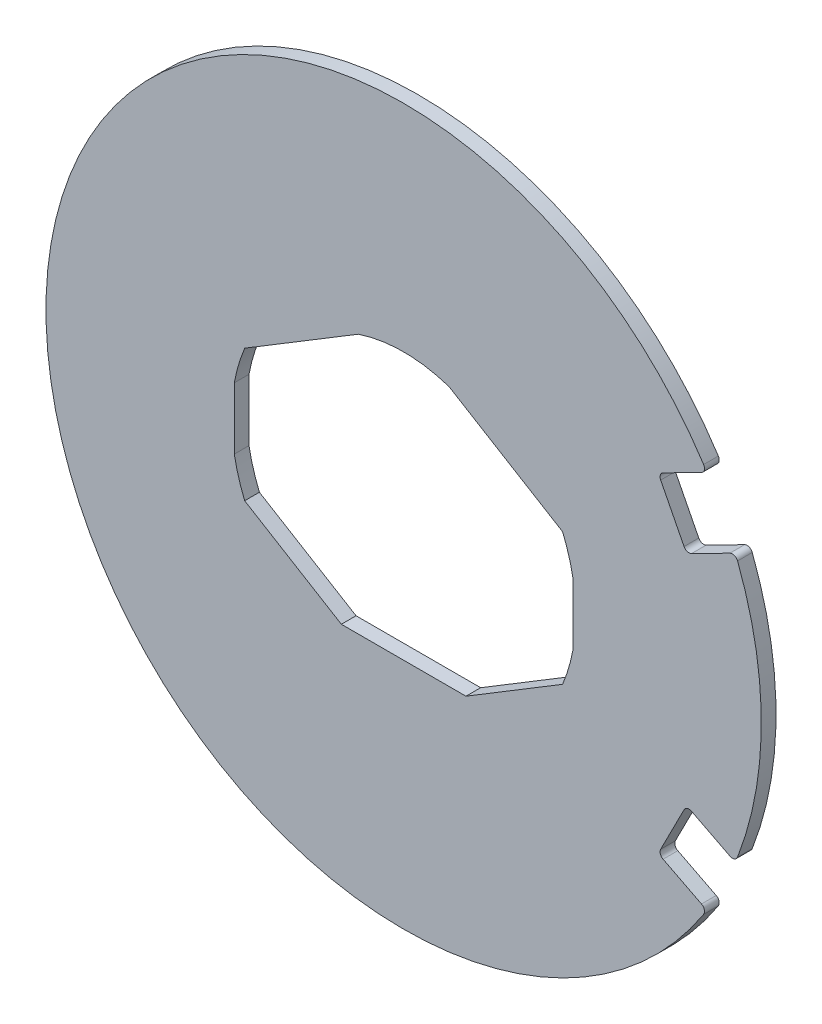
ISO-10303-21;
HEADER;
FILE_DESCRIPTION(('STEP AP214'),'2;1');
FILE_NAME('part.step','',(''),(''),'','','');
FILE_SCHEMA(('AUTOMOTIVE_DESIGN { 1 0 10303 214 1 1 1 1 }'));
ENDSEC;
DATA;
#1=APPLICATION_CONTEXT('core data for automotive mechanical design processes');
#2=APPLICATION_PROTOCOL_DEFINITION('international standard','automotive_design',2000,#1);
#3=PRODUCT_CONTEXT('',#1,'mechanical');
#4=PRODUCT('Part','Part','',(#3));
#5=PRODUCT_RELATED_PRODUCT_CATEGORY('part','',(#4));
#6=PRODUCT_DEFINITION_FORMATION('','',#4);
#7=PRODUCT_DEFINITION_CONTEXT('part definition',#1,'design');
#8=PRODUCT_DEFINITION('design','',#6,#7);
#9=PRODUCT_DEFINITION_SHAPE('','',#8);
#10=(LENGTH_UNIT() NAMED_UNIT(*) SI_UNIT(.MILLI.,.METRE.));
#11=(NAMED_UNIT(*) PLANE_ANGLE_UNIT() SI_UNIT($,.RADIAN.));
#12=(NAMED_UNIT(*) SI_UNIT($,.STERADIAN.) SOLID_ANGLE_UNIT());
#13=UNCERTAINTY_MEASURE_WITH_UNIT(LENGTH_MEASURE(1.E-05),#10,'distance_accuracy_value','');
#14=(GEOMETRIC_REPRESENTATION_CONTEXT(3) GLOBAL_UNCERTAINTY_ASSIGNED_CONTEXT((#13)) GLOBAL_UNIT_ASSIGNED_CONTEXT((#10,
#11,#12)) REPRESENTATION_CONTEXT('',''));
#15=CARTESIAN_POINT('',(0.,0.,0.));
#16=DIRECTION('',(0.,0.,1.));
#17=DIRECTION('',(1.,0.,0.));
#18=AXIS2_PLACEMENT_3D('',#15,#16,#17);
#19=CARTESIAN_POINT('',(15.5153956535811,6.33423221178673,0.8));
#20=DIRECTION('',(0.,0.,1.));
#21=DIRECTION('',(1.,0.,0.));
#22=AXIS2_PLACEMENT_3D('',#19,#20,#21);
#23=PLANE('',#22);
#24=CARTESIAN_POINT('',(15.5153956535811,6.33423221178673,0.8));
#25=DIRECTION('',(0.,0.,-1.));
#26=DIRECTION('',(1.,0.,0.));
#27=AXIS2_PLACEMENT_3D('',#24,#25,#26);
#28=CIRCLE('',#27,0.299999999999998);
#29=CARTESIAN_POINT('',(15.651592803503,6.06693025453023,0.8));
#30=VERTEX_POINT('',#29);
#31=CARTESIAN_POINT('',(15.2480936963246,6.19803506186487,0.8));
#32=VERTEX_POINT('',#31);
#33=EDGE_CURVE('E329',#30,#32,#28,.T.);
#34=ORIENTED_EDGE('',*,*,#33,.T.);
#35=DIRECTION('',(-0.453990499739548,0.891006524188367,0.));
#36=VECTOR('',#35,1.);
#37=CARTESIAN_POINT('',(13.9769202970539,8.6928533295923,0.8));
#38=LINE('',#37,#36);
#39=CARTESIAN_POINT('',(13.9769202970539,8.6928533295923,0.8));
#40=VERTEX_POINT('',#39);
#41=EDGE_CURVE('E332',#32,#40,#38,.T.);
#42=ORIENTED_EDGE('',*,*,#41,.T.);
#43=CARTESIAN_POINT('',(14.2442222543104,8.82905047951416,0.8));
#44=DIRECTION('',(0.,0.,-1.));
#45=DIRECTION('',(-1.,0.,0.));
#46=AXIS2_PLACEMENT_3D('',#43,#44,#45);
#47=CIRCLE('',#46,0.299999999999997);
#48=CARTESIAN_POINT('',(14.1080251043885,9.09635243677067,0.8));
#49=VERTEX_POINT('',#48);
#50=EDGE_CURVE('E335',#40,#49,#47,.T.);
#51=ORIENTED_EDGE('',*,*,#50,.T.);
#52=DIRECTION('',(0.891006524188367,0.453990499739549,0.));
#53=VECTOR('',#52,1.);
#54=CARTESIAN_POINT('',(14.1080251043885,9.09635243677067,0.8));
#55=LINE('',#54,#53);
#56=CARTESIAN_POINT('',(16.1976804344833,10.1610850081257,0.8));
#57=VERTEX_POINT('',#56);
#58=EDGE_CURVE('E337',#49,#57,#55,.T.);
#59=ORIENTED_EDGE('',*,*,#58,.T.);
#60=CARTESIAN_POINT('',(16.0614832845615,10.4283869653822,0.8));
#61=DIRECTION('',(0.,0.,1.));
#62=DIRECTION('',(1.,0.,0.));
#63=AXIS2_PLACEMENT_3D('',#60,#61,#62);
#64=CIRCLE('',#63,0.300000000000001);
#65=CARTESIAN_POINT('',(16.3130992106904,10.591755951785,0.8));
#66=VERTEX_POINT('',#65);
#67=EDGE_CURVE('E339',#57,#66,#64,.T.);
#68=ORIENTED_EDGE('',*,*,#67,.T.);
#69=CARTESIAN_POINT('',(0.,0.,0.8));
#70=DIRECTION('',(0.,0.,1.));
#71=DIRECTION('',(1.,0.,0.));
#72=AXIS2_PLACEMENT_3D('',#69,#70,#71);
#73=CIRCLE('',#72,19.45);
#74=CARTESIAN_POINT('',(16.3130992106904,-10.591755951785,0.8));
#75=VERTEX_POINT('',#74);
#76=EDGE_CURVE('E341',#66,#75,#73,.T.);
#77=ORIENTED_EDGE('',*,*,#76,.T.);
#78=CARTESIAN_POINT('',(16.0614832845615,-10.4283869653822,0.8));
#79=DIRECTION('',(0.,0.,1.));
#80=DIRECTION('',(-1.,0.,0.));
#81=AXIS2_PLACEMENT_3D('',#78,#79,#80);
#82=CIRCLE('',#81,0.300000000000001);
#83=CARTESIAN_POINT('',(16.1976804344833,-10.1610850081257,0.8));
#84=VERTEX_POINT('',#83);
#85=EDGE_CURVE('E343',#75,#84,#82,.T.);
#86=ORIENTED_EDGE('',*,*,#85,.T.);
#87=DIRECTION('',(-0.891006524188367,0.453990499739549,0.));
#88=VECTOR('',#87,1.);
#89=CARTESIAN_POINT('',(14.1080251043885,-9.09635243677067,0.8));
#90=LINE('',#89,#88);
#91=CARTESIAN_POINT('',(14.1080251043885,-9.09635243677067,0.8));
#92=VERTEX_POINT('',#91);
#93=EDGE_CURVE('E345',#84,#92,#90,.T.);
#94=ORIENTED_EDGE('',*,*,#93,.T.);
#95=CARTESIAN_POINT('',(14.2442222543104,-8.82905047951416,0.8));
#96=DIRECTION('',(0.,0.,-1.));
#97=DIRECTION('',(1.,0.,0.));
#98=AXIS2_PLACEMENT_3D('',#95,#96,#97);
#99=CIRCLE('',#98,0.299999999999997);
#100=CARTESIAN_POINT('',(13.9769202970539,-8.6928533295923,0.8));
#101=VERTEX_POINT('',#100);
#102=EDGE_CURVE('E347',#92,#101,#99,.T.);
#103=ORIENTED_EDGE('',*,*,#102,.T.);
#104=DIRECTION('',(0.453990499739548,0.891006524188367,0.));
#105=VECTOR('',#104,1.);
#106=CARTESIAN_POINT('',(13.9769202970539,-8.6928533295923,0.8));
#107=LINE('',#106,#105);
#108=CARTESIAN_POINT('',(15.2480936963246,-6.19803506186487,0.8));
#109=VERTEX_POINT('',#108);
#110=EDGE_CURVE('E349',#101,#109,#107,.T.);
#111=ORIENTED_EDGE('',*,*,#110,.T.);
#112=CARTESIAN_POINT('',(15.5153956535811,-6.33423221178673,0.8));
#113=DIRECTION('',(0.,0.,-1.));
#114=DIRECTION('',(-1.,0.,0.));
#115=AXIS2_PLACEMENT_3D('',#112,#113,#114);
#116=CIRCLE('',#115,0.299999999999998);
#117=CARTESIAN_POINT('',(15.651592803503,-6.06693025453023,0.8));
#118=VERTEX_POINT('',#117);
#119=EDGE_CURVE('E351',#109,#118,#116,.T.);
#120=ORIENTED_EDGE('',*,*,#119,.T.);
#121=DIRECTION('',(0.891006524188368,-0.453990499739547,0.));
#122=VECTOR('',#121,1.);
#123=CARTESIAN_POINT('',(15.651592803503,-6.06693025453023,0.8));
#124=LINE('',#123,#122);
#125=CARTESIAN_POINT('',(17.7412481335978,-7.13166282588522,0.8));
#126=VERTEX_POINT('',#125);
#127=EDGE_CURVE('E353',#118,#126,#124,.T.);
#128=ORIENTED_EDGE('',*,*,#127,.T.);
#129=CARTESIAN_POINT('',(17.8774452835196,-6.86436086862871,0.8));
#130=DIRECTION('',(0.,0.,1.));
#131=DIRECTION('',(-1.,0.,0.));
#132=AXIS2_PLACEMENT_3D('',#129,#130,#131);
#133=CIRCLE('',#132,0.299999999999999);
#134=CARTESIAN_POINT('',(18.1575097004938,-6.97189654803281,0.8));
#135=VERTEX_POINT('',#134);
#136=EDGE_CURVE('E355',#126,#135,#133,.T.);
#137=ORIENTED_EDGE('',*,*,#136,.T.);
#138=CARTESIAN_POINT('',(0.,0.,0.8));
#139=DIRECTION('',(0.,0.,1.));
#140=DIRECTION('',(1.,0.,0.));
#141=AXIS2_PLACEMENT_3D('',#138,#139,#140);
#142=CIRCLE('',#141,19.45);
#143=CARTESIAN_POINT('',(18.1575097004938,6.97189654803282,0.8));
#144=VERTEX_POINT('',#143);
#145=EDGE_CURVE('E357',#135,#144,#142,.T.);
#146=ORIENTED_EDGE('',*,*,#145,.T.);
#147=CARTESIAN_POINT('',(17.8774452835196,6.86436086862871,0.8));
#148=DIRECTION('',(0.,0.,1.));
#149=DIRECTION('',(1.,0.,0.));
#150=AXIS2_PLACEMENT_3D('',#147,#148,#149);
#151=CIRCLE('',#150,0.3);
#152=CARTESIAN_POINT('',(17.7412481335978,7.13166282588522,0.8));
#153=VERTEX_POINT('',#152);
#154=EDGE_CURVE('E359',#144,#153,#151,.T.);
#155=ORIENTED_EDGE('',*,*,#154,.T.);
#156=DIRECTION('',(-0.891006524188368,-0.453990499739547,0.));
#157=VECTOR('',#156,1.);
#158=CARTESIAN_POINT('',(15.651592803503,6.06693025453023,0.8));
#159=LINE('',#158,#157);
#160=EDGE_CURVE('E361',#153,#30,#159,.T.);
#161=ORIENTED_EDGE('',*,*,#160,.T.);
#162=EDGE_LOOP('',(#34,#42,#51,#59,#68,#77,#86,#94,#103,#111,#120,#128,#137,#146,#155,#161));
#163=FACE_BOUND('',#162,.T.);
#164=DIRECTION('',(0.855022756636304,-0.518590479698632,0.));
#165=VECTOR('',#164,1.);
#166=CARTESIAN_POINT('',(12.4518151338533,1.28317330558164,0.8));
#167=LINE('',#166,#165);
#168=CARTESIAN_POINT('',(2.4706068566245,7.337,0.8));
#169=VERTEX_POINT('',#168);
#170=CARTESIAN_POINT('',(8.64416255284455,3.5926,0.8));
#171=VERTEX_POINT('',#170);
#172=EDGE_CURVE('E325',#169,#171,#167,.T.);
#173=ORIENTED_EDGE('',*,*,#172,.T.);
#174=CARTESIAN_POINT('',(0.,0.,0.8));
#175=DIRECTION('',(0.,0.,1.));
#176=DIRECTION('',(1.,0.,0.));
#177=AXIS2_PLACEMENT_3D('',#174,#175,#176);
#178=CIRCLE('',#177,9.361);
#179=CARTESIAN_POINT('',(9.2092,1.67897479433135,0.8));
#180=VERTEX_POINT('',#179);
#181=EDGE_CURVE('E230',#171,#180,#178,.F.);
#182=ORIENTED_EDGE('',*,*,#181,.T.);
#183=DIRECTION('',(0.,-1.,0.));
#184=VECTOR('',#183,1.);
#185=CARTESIAN_POINT('',(9.2092,6.33423221178673,0.8));
#186=LINE('',#185,#184);
#187=CARTESIAN_POINT('',(9.2092,-1.67897479433135,0.8));
#188=VERTEX_POINT('',#187);
#189=EDGE_CURVE('E233',#180,#188,#186,.T.);
#190=ORIENTED_EDGE('',*,*,#189,.T.);
#191=CARTESIAN_POINT('',(0.,0.,0.8));
#192=DIRECTION('',(0.,0.,1.));
#193=DIRECTION('',(1.,0.,0.));
#194=AXIS2_PLACEMENT_3D('',#191,#192,#193);
#195=CIRCLE('',#194,9.361);
#196=CARTESIAN_POINT('',(8.64416255284455,-3.5926,0.8));
#197=VERTEX_POINT('',#196);
#198=EDGE_CURVE('E298',#188,#197,#195,.F.);
#199=ORIENTED_EDGE('',*,*,#198,.T.);
#200=DIRECTION('',(-0.855022756636303,-0.518590479698632,0.));
#201=VECTOR('',#200,1.);
#202=CARTESIAN_POINT('',(18.0690966504603,2.12383392748852,0.8));
#203=LINE('',#202,#201);
#204=CARTESIAN_POINT('',(3.38829756822478,-6.7804,0.8));
#205=VERTEX_POINT('',#204);
#206=EDGE_CURVE('E301',#197,#205,#203,.T.);
#207=ORIENTED_EDGE('',*,*,#206,.T.);
#208=DIRECTION('',(-1.,0.,0.));
#209=VECTOR('',#208,1.);
#210=CARTESIAN_POINT('',(15.5153956535811,-6.7804,0.8));
#211=LINE('',#210,#209);
#212=CARTESIAN_POINT('',(-3.38829756822478,-6.7804,0.8));
#213=VERTEX_POINT('',#212);
#214=EDGE_CURVE('E304',#205,#213,#211,.T.);
#215=ORIENTED_EDGE('',*,*,#214,.T.);
#216=DIRECTION('',(-0.855022756636303,0.518590479698632,0.));
#217=VECTOR('',#216,1.);
#218=CARTESIAN_POINT('',(4.61639510842641,-11.6354256502593,0.8));
#219=LINE('',#218,#217);
#220=CARTESIAN_POINT('',(-8.64416255284455,-3.5926,0.8));
#221=VERTEX_POINT('',#220);
#222=EDGE_CURVE('E307',#213,#221,#219,.T.);
#223=ORIENTED_EDGE('',*,*,#222,.T.);
#224=CARTESIAN_POINT('',(0.,0.,0.8));
#225=DIRECTION('',(0.,0.,1.));
#226=DIRECTION('',(1.,0.,0.));
#227=AXIS2_PLACEMENT_3D('',#224,#225,#226);
#228=CIRCLE('',#227,9.361);
#229=CARTESIAN_POINT('',(-9.2092,-1.67897479433134,0.8));
#230=VERTEX_POINT('',#229);
#231=EDGE_CURVE('E310',#221,#230,#228,.F.);
#232=ORIENTED_EDGE('',*,*,#231,.T.);
#233=DIRECTION('',(0.,1.,0.));
#234=VECTOR('',#233,1.);
#235=CARTESIAN_POINT('',(-9.2092,6.33423221178673,0.8));
#236=LINE('',#235,#234);
#237=CARTESIAN_POINT('',(-9.2092,1.67897479433135,0.8));
#238=VERTEX_POINT('',#237);
#239=EDGE_CURVE('E313',#230,#238,#236,.T.);
#240=ORIENTED_EDGE('',*,*,#239,.T.);
#241=CARTESIAN_POINT('',(0.,0.,0.8));
#242=DIRECTION('',(0.,0.,1.));
#243=DIRECTION('',(1.,0.,0.));
#244=AXIS2_PLACEMENT_3D('',#241,#242,#243);
#245=CIRCLE('',#244,9.361);
#246=CARTESIAN_POINT('',(-8.64416255284455,3.5926,0.8));
#247=VERTEX_POINT('',#246);
#248=EDGE_CURVE('E316',#238,#247,#245,.F.);
#249=ORIENTED_EDGE('',*,*,#248,.T.);
#250=DIRECTION('',(0.855022756636304,0.518590479698632,0.));
#251=VECTOR('',#250,1.);
#252=CARTESIAN_POINT('',(10.2336766250334,15.0424328833295,0.8));
#253=LINE('',#252,#251);
#254=CARTESIAN_POINT('',(-2.4706068566245,7.337,0.8));
#255=VERTEX_POINT('',#254);
#256=EDGE_CURVE('E319',#247,#255,#253,.T.);
#257=ORIENTED_EDGE('',*,*,#256,.T.);
#258=CARTESIAN_POINT('',(0.,0.,0.8));
#259=DIRECTION('',(0.,0.,1.));
#260=DIRECTION('',(1.,0.,0.));
#261=AXIS2_PLACEMENT_3D('',#258,#259,#260);
#262=CIRCLE('',#261,7.7418);
#263=EDGE_CURVE('E322',#255,#169,#262,.F.);
#264=ORIENTED_EDGE('',*,*,#263,.T.);
#265=EDGE_LOOP('',(#173,#182,#190,#199,#207,#215,#223,#232,#240,#249,#257,#264));
#266=FACE_BOUND('',#265,.T.);
#267=ADVANCED_FACE('F42',(#163,#266),#23,.T.);
#268=CARTESIAN_POINT('',(15.5153956535811,6.33423221178673,0.));
#269=DIRECTION('',(0.,0.,1.));
#270=DIRECTION('',(1.,0.,0.));
#271=AXIS2_PLACEMENT_3D('',#268,#269,#270);
#272=PLANE('',#271);
#273=CARTESIAN_POINT('',(15.5153956535811,6.33423221178673,0.));
#274=DIRECTION('',(0.,0.,-1.));
#275=DIRECTION('',(1.,0.,0.));
#276=AXIS2_PLACEMENT_3D('',#273,#274,#275);
#277=CIRCLE('',#276,0.299999999999998);
#278=CARTESIAN_POINT('',(15.651592803503,6.06693025453023,0.));
#279=VERTEX_POINT('',#278);
#280=CARTESIAN_POINT('',(15.2480936963246,6.19803506186487,0.));
#281=VERTEX_POINT('',#280);
#282=EDGE_CURVE('E328',#279,#281,#277,.T.);
#283=ORIENTED_EDGE('',*,*,#282,.F.);
#284=DIRECTION('',(-0.891006524188368,-0.453990499739547,0.));
#285=VECTOR('',#284,1.);
#286=CARTESIAN_POINT('',(15.651592803503,6.06693025453023,0.));
#287=LINE('',#286,#285);
#288=CARTESIAN_POINT('',(17.7412481335978,7.13166282588522,0.));
#289=VERTEX_POINT('',#288);
#290=EDGE_CURVE('E333',#289,#279,#287,.T.);
#291=ORIENTED_EDGE('',*,*,#290,.F.);
#292=CARTESIAN_POINT('',(17.8774452835196,6.86436086862871,0.));
#293=DIRECTION('',(0.,0.,1.));
#294=DIRECTION('',(1.,0.,0.));
#295=AXIS2_PLACEMENT_3D('',#292,#293,#294);
#296=CIRCLE('',#295,0.3);
#297=CARTESIAN_POINT('',(18.1575097004938,6.97189654803282,0.));
#298=VERTEX_POINT('',#297);
#299=EDGE_CURVE('E392',#298,#289,#296,.T.);
#300=ORIENTED_EDGE('',*,*,#299,.F.);
#301=CARTESIAN_POINT('',(0.,0.,0.));
#302=DIRECTION('',(0.,0.,1.));
#303=DIRECTION('',(1.,0.,0.));
#304=AXIS2_PLACEMENT_3D('',#301,#302,#303);
#305=CIRCLE('',#304,19.45);
#306=CARTESIAN_POINT('',(18.1575097004938,-6.97189654803281,0.));
#307=VERTEX_POINT('',#306);
#308=EDGE_CURVE('E390',#307,#298,#305,.T.);
#309=ORIENTED_EDGE('',*,*,#308,.F.);
#310=CARTESIAN_POINT('',(17.8774452835196,-6.86436086862871,0.));
#311=DIRECTION('',(0.,0.,1.));
#312=DIRECTION('',(-1.,0.,0.));
#313=AXIS2_PLACEMENT_3D('',#310,#311,#312);
#314=CIRCLE('',#313,0.299999999999999);
#315=CARTESIAN_POINT('',(17.7412481335978,-7.13166282588522,0.));
#316=VERTEX_POINT('',#315);
#317=EDGE_CURVE('E388',#316,#307,#314,.T.);
#318=ORIENTED_EDGE('',*,*,#317,.F.);
#319=DIRECTION('',(0.891006524188368,-0.453990499739547,0.));
#320=VECTOR('',#319,1.);
#321=CARTESIAN_POINT('',(15.651592803503,-6.06693025453023,0.));
#322=LINE('',#321,#320);
#323=CARTESIAN_POINT('',(15.651592803503,-6.06693025453023,0.));
#324=VERTEX_POINT('',#323);
#325=EDGE_CURVE('E386',#324,#316,#322,.T.);
#326=ORIENTED_EDGE('',*,*,#325,.F.);
#327=CARTESIAN_POINT('',(15.5153956535811,-6.33423221178673,0.));
#328=DIRECTION('',(0.,0.,-1.));
#329=DIRECTION('',(-1.,0.,0.));
#330=AXIS2_PLACEMENT_3D('',#327,#328,#329);
#331=CIRCLE('',#330,0.299999999999998);
#332=CARTESIAN_POINT('',(15.2480936963246,-6.19803506186487,0.));
#333=VERTEX_POINT('',#332);
#334=EDGE_CURVE('E384',#333,#324,#331,.T.);
#335=ORIENTED_EDGE('',*,*,#334,.F.);
#336=DIRECTION('',(0.453990499739548,0.891006524188367,0.));
#337=VECTOR('',#336,1.);
#338=CARTESIAN_POINT('',(13.9769202970539,-8.6928533295923,0.));
#339=LINE('',#338,#337);
#340=CARTESIAN_POINT('',(13.9769202970539,-8.6928533295923,0.));
#341=VERTEX_POINT('',#340);
#342=EDGE_CURVE('E382',#341,#333,#339,.T.);
#343=ORIENTED_EDGE('',*,*,#342,.F.);
#344=CARTESIAN_POINT('',(14.2442222543104,-8.82905047951416,0.));
#345=DIRECTION('',(0.,0.,-1.));
#346=DIRECTION('',(1.,0.,0.));
#347=AXIS2_PLACEMENT_3D('',#344,#345,#346);
#348=CIRCLE('',#347,0.299999999999997);
#349=CARTESIAN_POINT('',(14.1080251043885,-9.09635243677067,0.));
#350=VERTEX_POINT('',#349);
#351=EDGE_CURVE('E380',#350,#341,#348,.T.);
#352=ORIENTED_EDGE('',*,*,#351,.F.);
#353=DIRECTION('',(-0.891006524188367,0.453990499739549,0.));
#354=VECTOR('',#353,1.);
#355=CARTESIAN_POINT('',(14.1080251043885,-9.09635243677067,0.));
#356=LINE('',#355,#354);
#357=CARTESIAN_POINT('',(16.1976804344833,-10.1610850081257,0.));
#358=VERTEX_POINT('',#357);
#359=EDGE_CURVE('E378',#358,#350,#356,.T.);
#360=ORIENTED_EDGE('',*,*,#359,.F.);
#361=CARTESIAN_POINT('',(16.0614832845615,-10.4283869653822,0.));
#362=DIRECTION('',(0.,0.,1.));
#363=DIRECTION('',(-1.,0.,0.));
#364=AXIS2_PLACEMENT_3D('',#361,#362,#363);
#365=CIRCLE('',#364,0.300000000000001);
#366=CARTESIAN_POINT('',(16.3130992106904,-10.591755951785,0.));
#367=VERTEX_POINT('',#366);
#368=EDGE_CURVE('E376',#367,#358,#365,.T.);
#369=ORIENTED_EDGE('',*,*,#368,.F.);
#370=CARTESIAN_POINT('',(0.,0.,0.));
#371=DIRECTION('',(0.,0.,1.));
#372=DIRECTION('',(1.,0.,0.));
#373=AXIS2_PLACEMENT_3D('',#370,#371,#372);
#374=CIRCLE('',#373,19.45);
#375=CARTESIAN_POINT('',(16.3130992106904,10.591755951785,0.));
#376=VERTEX_POINT('',#375);
#377=EDGE_CURVE('E374',#376,#367,#374,.T.);
#378=ORIENTED_EDGE('',*,*,#377,.F.);
#379=CARTESIAN_POINT('',(16.0614832845615,10.4283869653822,0.));
#380=DIRECTION('',(0.,0.,1.));
#381=DIRECTION('',(1.,0.,0.));
#382=AXIS2_PLACEMENT_3D('',#379,#380,#381);
#383=CIRCLE('',#382,0.300000000000001);
#384=CARTESIAN_POINT('',(16.1976804344833,10.1610850081257,0.));
#385=VERTEX_POINT('',#384);
#386=EDGE_CURVE('E372',#385,#376,#383,.T.);
#387=ORIENTED_EDGE('',*,*,#386,.F.);
#388=DIRECTION('',(0.891006524188367,0.453990499739549,0.));
#389=VECTOR('',#388,1.);
#390=CARTESIAN_POINT('',(14.1080251043885,9.09635243677067,0.));
#391=LINE('',#390,#389);
#392=CARTESIAN_POINT('',(14.1080251043885,9.09635243677067,0.));
#393=VERTEX_POINT('',#392);
#394=EDGE_CURVE('E370',#393,#385,#391,.T.);
#395=ORIENTED_EDGE('',*,*,#394,.F.);
#396=CARTESIAN_POINT('',(14.2442222543104,8.82905047951416,0.));
#397=DIRECTION('',(0.,0.,-1.));
#398=DIRECTION('',(-1.,0.,0.));
#399=AXIS2_PLACEMENT_3D('',#396,#397,#398);
#400=CIRCLE('',#399,0.299999999999997);
#401=CARTESIAN_POINT('',(13.9769202970539,8.6928533295923,0.));
#402=VERTEX_POINT('',#401);
#403=EDGE_CURVE('E368',#402,#393,#400,.T.);
#404=ORIENTED_EDGE('',*,*,#403,.F.);
#405=DIRECTION('',(-0.453990499739548,0.891006524188367,0.));
#406=VECTOR('',#405,1.);
#407=CARTESIAN_POINT('',(13.9769202970539,8.6928533295923,0.));
#408=LINE('',#407,#406);
#409=EDGE_CURVE('E366',#281,#402,#408,.T.);
#410=ORIENTED_EDGE('',*,*,#409,.F.);
#411=EDGE_LOOP('',(#283,#291,#300,#309,#318,#326,#335,#343,#352,#360,#369,#378,#387,#395,#404,#410));
#412=FACE_BOUND('',#411,.T.);
#413=CARTESIAN_POINT('',(0.,0.,0.));
#414=DIRECTION('',(0.,0.,1.));
#415=DIRECTION('',(1.,0.,0.));
#416=AXIS2_PLACEMENT_3D('',#413,#414,#415);
#417=CIRCLE('',#416,9.361);
#418=CARTESIAN_POINT('',(9.2092,1.67897479433135,0.));
#419=VERTEX_POINT('',#418);
#420=CARTESIAN_POINT('',(8.64416255284455,3.5926,0.));
#421=VERTEX_POINT('',#420);
#422=EDGE_CURVE('E65',#419,#421,#417,.T.);
#423=ORIENTED_EDGE('',*,*,#422,.T.);
#424=DIRECTION('',(-0.855022756636303,0.518590479698632,0.));
#425=VECTOR('',#424,1.);
#426=CARTESIAN_POINT('',(2.4706068566245,7.337,0.));
#427=LINE('',#426,#425);
#428=CARTESIAN_POINT('',(2.4706068566245,7.337,0.));
#429=VERTEX_POINT('',#428);
#430=EDGE_CURVE('E237',#421,#429,#427,.T.);
#431=ORIENTED_EDGE('',*,*,#430,.T.);
#432=CARTESIAN_POINT('',(0.,0.,0.));
#433=DIRECTION('',(0.,0.,1.));
#434=DIRECTION('',(1.,0.,0.));
#435=AXIS2_PLACEMENT_3D('',#432,#433,#434);
#436=CIRCLE('',#435,7.7418);
#437=CARTESIAN_POINT('',(-2.4706068566245,7.337,0.));
#438=VERTEX_POINT('',#437);
#439=EDGE_CURVE('E243',#429,#438,#436,.T.);
#440=ORIENTED_EDGE('',*,*,#439,.T.);
#441=DIRECTION('',(-0.855022756636303,-0.518590479698632,0.));
#442=VECTOR('',#441,1.);
#443=CARTESIAN_POINT('',(-2.4706068566245,7.337,0.));
#444=LINE('',#443,#442);
#445=CARTESIAN_POINT('',(-8.64416255284455,3.5926,0.));
#446=VERTEX_POINT('',#445);
#447=EDGE_CURVE('E252',#438,#446,#444,.T.);
#448=ORIENTED_EDGE('',*,*,#447,.T.);
#449=CARTESIAN_POINT('',(0.,0.,0.));
#450=DIRECTION('',(0.,0.,1.));
#451=DIRECTION('',(-1.,0.,0.));
#452=AXIS2_PLACEMENT_3D('',#449,#450,#451);
#453=CIRCLE('',#452,9.361);
#454=CARTESIAN_POINT('',(-9.2092,1.67897479433135,0.));
#455=VERTEX_POINT('',#454);
#456=EDGE_CURVE('E255',#446,#455,#453,.T.);
#457=ORIENTED_EDGE('',*,*,#456,.T.);
#458=DIRECTION('',(0.,-1.,0.));
#459=VECTOR('',#458,1.);
#460=CARTESIAN_POINT('',(-9.2092,1.67897479433135,0.));
#461=LINE('',#460,#459);
#462=CARTESIAN_POINT('',(-9.2092,-1.67897479433134,0.));
#463=VERTEX_POINT('',#462);
#464=EDGE_CURVE('E258',#455,#463,#461,.T.);
#465=ORIENTED_EDGE('',*,*,#464,.T.);
#466=CARTESIAN_POINT('',(0.,0.,0.));
#467=DIRECTION('',(0.,0.,1.));
#468=DIRECTION('',(1.,0.,0.));
#469=AXIS2_PLACEMENT_3D('',#466,#467,#468);
#470=CIRCLE('',#469,9.361);
#471=CARTESIAN_POINT('',(-8.64416255284455,-3.5926,0.));
#472=VERTEX_POINT('',#471);
#473=EDGE_CURVE('E261',#463,#472,#470,.T.);
#474=ORIENTED_EDGE('',*,*,#473,.T.);
#475=DIRECTION('',(0.855022756636303,-0.518590479698632,0.));
#476=VECTOR('',#475,1.);
#477=CARTESIAN_POINT('',(-3.38829756822478,-6.7804,0.));
#478=LINE('',#477,#476);
#479=CARTESIAN_POINT('',(-3.38829756822478,-6.7804,0.));
#480=VERTEX_POINT('',#479);
#481=EDGE_CURVE('E264',#472,#480,#478,.T.);
#482=ORIENTED_EDGE('',*,*,#481,.T.);
#483=DIRECTION('',(1.,0.,0.));
#484=VECTOR('',#483,1.);
#485=CARTESIAN_POINT('',(-3.38829756822478,-6.7804,0.));
#486=LINE('',#485,#484);
#487=CARTESIAN_POINT('',(3.38829756822478,-6.7804,0.));
#488=VERTEX_POINT('',#487);
#489=EDGE_CURVE('E267',#480,#488,#486,.T.);
#490=ORIENTED_EDGE('',*,*,#489,.T.);
#491=DIRECTION('',(0.855022756636303,0.518590479698632,0.));
#492=VECTOR('',#491,1.);
#493=CARTESIAN_POINT('',(3.38829756822478,-6.7804,0.));
#494=LINE('',#493,#492);
#495=CARTESIAN_POINT('',(8.64416255284455,-3.5926,0.));
#496=VERTEX_POINT('',#495);
#497=EDGE_CURVE('E270',#488,#496,#494,.T.);
#498=ORIENTED_EDGE('',*,*,#497,.T.);
#499=CARTESIAN_POINT('',(0.,0.,0.));
#500=DIRECTION('',(0.,0.,1.));
#501=DIRECTION('',(-1.,0.,0.));
#502=AXIS2_PLACEMENT_3D('',#499,#500,#501);
#503=CIRCLE('',#502,9.361);
#504=CARTESIAN_POINT('',(9.2092,-1.67897479433135,0.));
#505=VERTEX_POINT('',#504);
#506=EDGE_CURVE('E273',#496,#505,#503,.T.);
#507=ORIENTED_EDGE('',*,*,#506,.T.);
#508=DIRECTION('',(0.,1.,0.));
#509=VECTOR('',#508,1.);
#510=CARTESIAN_POINT('',(9.2092,1.67897479433135,0.));
#511=LINE('',#510,#509);
#512=EDGE_CURVE('E248',#505,#419,#511,.T.);
#513=ORIENTED_EDGE('',*,*,#512,.T.);
#514=EDGE_LOOP('',(#423,#431,#440,#448,#457,#465,#474,#482,#490,#498,#507,#513));
#515=FACE_BOUND('',#514,.T.);
#516=ADVANCED_FACE('F246',(#412,#515),#272,.F.);
#517=CARTESIAN_POINT('',(15.5153956535811,6.33423221178673,0.8));
#518=DIRECTION('',(0.,0.,-1.));
#519=DIRECTION('',(-1.,0.,0.));
#520=AXIS2_PLACEMENT_3D('',#517,#518,#519);
#521=CYLINDRICAL_SURFACE('',#520,0.299999999999998);
#522=ORIENTED_EDGE('',*,*,#282,.T.);
#523=DIRECTION('',(0.,0.,-1.));
#524=VECTOR('',#523,1.);
#525=CARTESIAN_POINT('',(15.2480936963246,6.19803506186487,0.8));
#526=LINE('',#525,#524);
#527=EDGE_CURVE('E11',#32,#281,#526,.T.);
#528=ORIENTED_EDGE('',*,*,#527,.F.);
#529=ORIENTED_EDGE('',*,*,#33,.F.);
#530=DIRECTION('',(0.,0.,-1.));
#531=VECTOR('',#530,1.);
#532=CARTESIAN_POINT('',(15.651592803503,6.06693025453023,0.8));
#533=LINE('',#532,#531);
#534=EDGE_CURVE('E363',#30,#279,#533,.T.);
#535=ORIENTED_EDGE('',*,*,#534,.T.);
#536=EDGE_LOOP('',(#522,#528,#529,#535));
#537=FACE_BOUND('',#536,.T.);
#538=ADVANCED_FACE('F44',(#537),#521,.F.);
#539=CARTESIAN_POINT('',(13.9769202970539,8.6928533295923,0.8));
#540=DIRECTION('',(-0.891006524188367,-0.453990499739548,0.));
#541=DIRECTION('',(0.453990499739548,-0.891006524188367,0.));
#542=AXIS2_PLACEMENT_3D('',#539,#540,#541);
#543=PLANE('',#542);
#544=ORIENTED_EDGE('',*,*,#409,.T.);
#545=DIRECTION('',(0.,0.,-1.));
#546=VECTOR('',#545,1.);
#547=CARTESIAN_POINT('',(13.9769202970539,8.6928533295923,0.8));
#548=LINE('',#547,#546);
#549=EDGE_CURVE('E50',#40,#402,#548,.T.);
#550=ORIENTED_EDGE('',*,*,#549,.F.);
#551=ORIENTED_EDGE('',*,*,#41,.F.);
#552=ORIENTED_EDGE('',*,*,#527,.T.);
#553=EDGE_LOOP('',(#544,#550,#551,#552));
#554=FACE_BOUND('',#553,.T.);
#555=ADVANCED_FACE('F462',(#554),#543,.F.);
#556=CARTESIAN_POINT('',(14.2442222543104,8.82905047951416,0.8));
#557=DIRECTION('',(0.,0.,-1.));
#558=DIRECTION('',(-1.,0.,0.));
#559=AXIS2_PLACEMENT_3D('',#556,#557,#558);
#560=CYLINDRICAL_SURFACE('',#559,0.299999999999997);
#561=ORIENTED_EDGE('',*,*,#403,.T.);
#562=DIRECTION('',(0.,0.,-1.));
#563=VECTOR('',#562,1.);
#564=CARTESIAN_POINT('',(14.1080251043885,9.09635243677067,0.8));
#565=LINE('',#564,#563);
#566=EDGE_CURVE('E433',#49,#393,#565,.T.);
#567=ORIENTED_EDGE('',*,*,#566,.F.);
#568=ORIENTED_EDGE('',*,*,#50,.F.);
#569=ORIENTED_EDGE('',*,*,#549,.T.);
#570=EDGE_LOOP('',(#561,#567,#568,#569));
#571=FACE_BOUND('',#570,.T.);
#572=ADVANCED_FACE('F440',(#571),#560,.F.);
#573=CARTESIAN_POINT('',(14.1080251043885,9.09635243677067,0.8));
#574=DIRECTION('',(-0.453990499739549,0.891006524188367,0.));
#575=DIRECTION('',(-0.891006524188367,-0.453990499739549,0.));
#576=AXIS2_PLACEMENT_3D('',#573,#574,#575);
#577=PLANE('',#576);
#578=ORIENTED_EDGE('',*,*,#394,.T.);
#579=DIRECTION('',(0.,0.,-1.));
#580=VECTOR('',#579,1.);
#581=CARTESIAN_POINT('',(16.1976804344833,10.1610850081257,0.8));
#582=LINE('',#581,#580);
#583=EDGE_CURVE('E430',#57,#385,#582,.T.);
#584=ORIENTED_EDGE('',*,*,#583,.F.);
#585=ORIENTED_EDGE('',*,*,#58,.F.);
#586=ORIENTED_EDGE('',*,*,#566,.T.);
#587=EDGE_LOOP('',(#578,#584,#585,#586));
#588=FACE_BOUND('',#587,.T.);
#589=ADVANCED_FACE('F450',(#588),#577,.F.);
#590=CARTESIAN_POINT('',(16.0614832845615,10.4283869653822,0.8));
#591=DIRECTION('',(0.,0.,-1.));
#592=DIRECTION('',(-1.,0.,0.));
#593=AXIS2_PLACEMENT_3D('',#590,#591,#592);
#594=CYLINDRICAL_SURFACE('',#593,0.300000000000001);
#595=ORIENTED_EDGE('',*,*,#386,.T.);
#596=DIRECTION('',(0.,0.,-1.));
#597=VECTOR('',#596,1.);
#598=CARTESIAN_POINT('',(16.3130992106904,10.591755951785,0.8));
#599=LINE('',#598,#597);
#600=EDGE_CURVE('E427',#66,#376,#599,.T.);
#601=ORIENTED_EDGE('',*,*,#600,.F.);
#602=ORIENTED_EDGE('',*,*,#67,.F.);
#603=ORIENTED_EDGE('',*,*,#583,.T.);
#604=EDGE_LOOP('',(#595,#601,#602,#603));
#605=FACE_BOUND('',#604,.T.);
#606=ADVANCED_FACE('F454',(#605),#594,.T.);
#607=CARTESIAN_POINT('',(0.,0.,0.8));
#608=DIRECTION('',(0.,0.,-1.));
#609=DIRECTION('',(-1.,0.,0.));
#610=AXIS2_PLACEMENT_3D('',#607,#608,#609);
#611=CYLINDRICAL_SURFACE('',#610,19.45);
#612=ORIENTED_EDGE('',*,*,#377,.T.);
#613=DIRECTION('',(0.,0.,-1.));
#614=VECTOR('',#613,1.);
#615=CARTESIAN_POINT('',(16.3130992106904,-10.591755951785,0.8));
#616=LINE('',#615,#614);
#617=EDGE_CURVE('E424',#75,#367,#616,.T.);
#618=ORIENTED_EDGE('',*,*,#617,.F.);
#619=ORIENTED_EDGE('',*,*,#76,.F.);
#620=ORIENTED_EDGE('',*,*,#600,.T.);
#621=EDGE_LOOP('',(#612,#618,#619,#620));
#622=FACE_BOUND('',#621,.T.);
#623=ADVANCED_FACE('F515',(#622),#611,.T.);
#624=CARTESIAN_POINT('',(16.0614832845615,-10.4283869653822,0.8));
#625=DIRECTION('',(0.,0.,-1.));
#626=DIRECTION('',(-1.,0.,0.));
#627=AXIS2_PLACEMENT_3D('',#624,#625,#626);
#628=CYLINDRICAL_SURFACE('',#627,0.300000000000001);
#629=ORIENTED_EDGE('',*,*,#368,.T.);
#630=DIRECTION('',(0.,0.,-1.));
#631=VECTOR('',#630,1.);
#632=CARTESIAN_POINT('',(16.1976804344833,-10.1610850081257,0.8));
#633=LINE('',#632,#631);
#634=EDGE_CURVE('E421',#84,#358,#633,.T.);
#635=ORIENTED_EDGE('',*,*,#634,.F.);
#636=ORIENTED_EDGE('',*,*,#85,.F.);
#637=ORIENTED_EDGE('',*,*,#617,.T.);
#638=EDGE_LOOP('',(#629,#635,#636,#637));
#639=FACE_BOUND('',#638,.T.);
#640=ADVANCED_FACE('F512',(#639),#628,.T.);
#641=CARTESIAN_POINT('',(14.1080251043885,-9.09635243677067,0.8));
#642=DIRECTION('',(-0.453990499739549,-0.891006524188367,0.));
#643=DIRECTION('',(0.891006524188367,-0.453990499739549,0.));
#644=AXIS2_PLACEMENT_3D('',#641,#642,#643);
#645=PLANE('',#644);
#646=ORIENTED_EDGE('',*,*,#359,.T.);
#647=DIRECTION('',(0.,0.,-1.));
#648=VECTOR('',#647,1.);
#649=CARTESIAN_POINT('',(14.1080251043885,-9.09635243677067,0.8));
#650=LINE('',#649,#648);
#651=EDGE_CURVE('E418',#92,#350,#650,.T.);
#652=ORIENTED_EDGE('',*,*,#651,.F.);
#653=ORIENTED_EDGE('',*,*,#93,.F.);
#654=ORIENTED_EDGE('',*,*,#634,.T.);
#655=EDGE_LOOP('',(#646,#652,#653,#654));
#656=FACE_BOUND('',#655,.T.);
#657=ADVANCED_FACE('F508',(#656),#645,.F.);
#658=CARTESIAN_POINT('',(14.2442222543104,-8.82905047951416,0.8));
#659=DIRECTION('',(0.,0.,-1.));
#660=DIRECTION('',(-1.,0.,0.));
#661=AXIS2_PLACEMENT_3D('',#658,#659,#660);
#662=CYLINDRICAL_SURFACE('',#661,0.299999999999997);
#663=ORIENTED_EDGE('',*,*,#351,.T.);
#664=DIRECTION('',(0.,0.,-1.));
#665=VECTOR('',#664,1.);
#666=CARTESIAN_POINT('',(13.9769202970539,-8.6928533295923,0.8));
#667=LINE('',#666,#665);
#668=EDGE_CURVE('E415',#101,#341,#667,.T.);
#669=ORIENTED_EDGE('',*,*,#668,.F.);
#670=ORIENTED_EDGE('',*,*,#102,.F.);
#671=ORIENTED_EDGE('',*,*,#651,.T.);
#672=EDGE_LOOP('',(#663,#669,#670,#671));
#673=FACE_BOUND('',#672,.T.);
#674=ADVANCED_FACE('F504',(#673),#662,.F.);
#675=CARTESIAN_POINT('',(13.9769202970539,-8.6928533295923,0.8));
#676=DIRECTION('',(-0.891006524188367,0.453990499739548,0.));
#677=DIRECTION('',(-0.453990499739548,-0.891006524188367,0.));
#678=AXIS2_PLACEMENT_3D('',#675,#676,#677);
#679=PLANE('',#678);
#680=ORIENTED_EDGE('',*,*,#342,.T.);
#681=DIRECTION('',(0.,0.,-1.));
#682=VECTOR('',#681,1.);
#683=CARTESIAN_POINT('',(15.2480936963246,-6.19803506186487,0.8));
#684=LINE('',#683,#682);
#685=EDGE_CURVE('E412',#109,#333,#684,.T.);
#686=ORIENTED_EDGE('',*,*,#685,.F.);
#687=ORIENTED_EDGE('',*,*,#110,.F.);
#688=ORIENTED_EDGE('',*,*,#668,.T.);
#689=EDGE_LOOP('',(#680,#686,#687,#688));
#690=FACE_BOUND('',#689,.T.);
#691=ADVANCED_FACE('F499',(#690),#679,.F.);
#692=CARTESIAN_POINT('',(15.5153956535811,-6.33423221178673,0.8));
#693=DIRECTION('',(0.,0.,-1.));
#694=DIRECTION('',(-1.,0.,0.));
#695=AXIS2_PLACEMENT_3D('',#692,#693,#694);
#696=CYLINDRICAL_SURFACE('',#695,0.299999999999998);
#697=ORIENTED_EDGE('',*,*,#334,.T.);
#698=DIRECTION('',(0.,0.,-1.));
#699=VECTOR('',#698,1.);
#700=CARTESIAN_POINT('',(15.651592803503,-6.06693025453023,0.8));
#701=LINE('',#700,#699);
#702=EDGE_CURVE('E409',#118,#324,#701,.T.);
#703=ORIENTED_EDGE('',*,*,#702,.F.);
#704=ORIENTED_EDGE('',*,*,#119,.F.);
#705=ORIENTED_EDGE('',*,*,#685,.T.);
#706=EDGE_LOOP('',(#697,#703,#704,#705));
#707=FACE_BOUND('',#706,.T.);
#708=ADVANCED_FACE('F493',(#707),#696,.F.);
#709=CARTESIAN_POINT('',(15.651592803503,-6.06693025453023,0.8));
#710=DIRECTION('',(0.453990499739547,0.891006524188368,0.));
#711=DIRECTION('',(-0.891006524188368,0.453990499739547,0.));
#712=AXIS2_PLACEMENT_3D('',#709,#710,#711);
#713=PLANE('',#712);
#714=ORIENTED_EDGE('',*,*,#325,.T.);
#715=DIRECTION('',(0.,0.,-1.));
#716=VECTOR('',#715,1.);
#717=CARTESIAN_POINT('',(17.7412481335978,-7.13166282588522,0.8));
#718=LINE('',#717,#716);
#719=EDGE_CURVE('E406',#126,#316,#718,.T.);
#720=ORIENTED_EDGE('',*,*,#719,.F.);
#721=ORIENTED_EDGE('',*,*,#127,.F.);
#722=ORIENTED_EDGE('',*,*,#702,.T.);
#723=EDGE_LOOP('',(#714,#720,#721,#722));
#724=FACE_BOUND('',#723,.T.);
#725=ADVANCED_FACE('F489',(#724),#713,.F.);
#726=CARTESIAN_POINT('',(17.8774452835196,-6.86436086862871,0.8));
#727=DIRECTION('',(0.,0.,-1.));
#728=DIRECTION('',(-1.,0.,0.));
#729=AXIS2_PLACEMENT_3D('',#726,#727,#728);
#730=CYLINDRICAL_SURFACE('',#729,0.299999999999999);
#731=ORIENTED_EDGE('',*,*,#317,.T.);
#732=DIRECTION('',(0.,0.,-1.));
#733=VECTOR('',#732,1.);
#734=CARTESIAN_POINT('',(18.1575097004938,-6.97189654803281,0.8));
#735=LINE('',#734,#733);
#736=EDGE_CURVE('E403',#135,#307,#735,.T.);
#737=ORIENTED_EDGE('',*,*,#736,.F.);
#738=ORIENTED_EDGE('',*,*,#136,.F.);
#739=ORIENTED_EDGE('',*,*,#719,.T.);
#740=EDGE_LOOP('',(#731,#737,#738,#739));
#741=FACE_BOUND('',#740,.T.);
#742=ADVANCED_FACE('F484',(#741),#730,.T.);
#743=CARTESIAN_POINT('',(0.,0.,0.8));
#744=DIRECTION('',(0.,0.,-1.));
#745=DIRECTION('',(-1.,0.,0.));
#746=AXIS2_PLACEMENT_3D('',#743,#744,#745);
#747=CYLINDRICAL_SURFACE('',#746,19.45);
#748=ORIENTED_EDGE('',*,*,#308,.T.);
#749=DIRECTION('',(0.,0.,-1.));
#750=VECTOR('',#749,1.);
#751=CARTESIAN_POINT('',(18.1575097004938,6.97189654803282,0.8));
#752=LINE('',#751,#750);
#753=EDGE_CURVE('E400',#144,#298,#752,.T.);
#754=ORIENTED_EDGE('',*,*,#753,.F.);
#755=ORIENTED_EDGE('',*,*,#145,.F.);
#756=ORIENTED_EDGE('',*,*,#736,.T.);
#757=EDGE_LOOP('',(#748,#754,#755,#756));
#758=FACE_BOUND('',#757,.T.);
#759=ADVANCED_FACE('F478',(#758),#747,.T.);
#760=CARTESIAN_POINT('',(17.8774452835196,6.86436086862871,0.8));
#761=DIRECTION('',(0.,0.,-1.));
#762=DIRECTION('',(-1.,0.,0.));
#763=AXIS2_PLACEMENT_3D('',#760,#761,#762);
#764=CYLINDRICAL_SURFACE('',#763,0.3);
#765=ORIENTED_EDGE('',*,*,#299,.T.);
#766=DIRECTION('',(0.,0.,-1.));
#767=VECTOR('',#766,1.);
#768=CARTESIAN_POINT('',(17.7412481335978,7.13166282588522,0.8));
#769=LINE('',#768,#767);
#770=EDGE_CURVE('E397',#153,#289,#769,.T.);
#771=ORIENTED_EDGE('',*,*,#770,.F.);
#772=ORIENTED_EDGE('',*,*,#154,.F.);
#773=ORIENTED_EDGE('',*,*,#753,.T.);
#774=EDGE_LOOP('',(#765,#771,#772,#773));
#775=FACE_BOUND('',#774,.T.);
#776=ADVANCED_FACE('F474',(#775),#764,.T.);
#777=CARTESIAN_POINT('',(15.651592803503,6.06693025453023,0.8));
#778=DIRECTION('',(0.453990499739547,-0.891006524188368,0.));
#779=DIRECTION('',(0.891006524188368,0.453990499739547,0.));
#780=AXIS2_PLACEMENT_3D('',#777,#778,#779);
#781=PLANE('',#780);
#782=ORIENTED_EDGE('',*,*,#290,.T.);
#783=ORIENTED_EDGE('',*,*,#534,.F.);
#784=ORIENTED_EDGE('',*,*,#160,.F.);
#785=ORIENTED_EDGE('',*,*,#770,.T.);
#786=EDGE_LOOP('',(#782,#783,#784,#785));
#787=FACE_BOUND('',#786,.T.);
#788=ADVANCED_FACE('F469',(#787),#781,.F.);
#789=CARTESIAN_POINT('',(0.,0.,3.1878));
#790=DIRECTION('',(0.,0.,-1.));
#791=DIRECTION('',(-1.,0.,0.));
#792=AXIS2_PLACEMENT_3D('',#789,#790,#791);
#793=CYLINDRICAL_SURFACE('',#792,9.361);
#794=DIRECTION('',(0.,0.,-1.));
#795=VECTOR('',#794,1.);
#796=CARTESIAN_POINT('',(8.64416255284455,3.5926,3.1878));
#797=LINE('',#796,#795);
#798=EDGE_CURVE('E226',#171,#421,#797,.T.);
#799=ORIENTED_EDGE('',*,*,#798,.T.);
#800=ORIENTED_EDGE('',*,*,#422,.F.);
#801=DIRECTION('',(0.,0.,-1.));
#802=VECTOR('',#801,1.);
#803=CARTESIAN_POINT('',(9.2092,1.67897479433135,3.1878));
#804=LINE('',#803,#802);
#805=EDGE_CURVE('E276',#180,#419,#804,.T.);
#806=ORIENTED_EDGE('',*,*,#805,.F.);
#807=ORIENTED_EDGE('',*,*,#181,.F.);
#808=EDGE_LOOP('',(#799,#800,#806,#807));
#809=FACE_BOUND('',#808,.T.);
#810=ADVANCED_FACE('F228',(#809),#793,.F.);
#811=CARTESIAN_POINT('',(2.4706068566245,7.337,3.1878));
#812=DIRECTION('',(-0.518590479698631,-0.855022756636303,0.));
#813=DIRECTION('',(0.855022756636304,-0.518590479698632,0.));
#814=AXIS2_PLACEMENT_3D('',#811,#812,#813);
#815=PLANE('',#814);
#816=DIRECTION('',(0.,0.,-1.));
#817=VECTOR('',#816,1.);
#818=CARTESIAN_POINT('',(2.4706068566245,7.337,3.1878));
#819=LINE('',#818,#817);
#820=EDGE_CURVE('E234',#169,#429,#819,.T.);
#821=ORIENTED_EDGE('',*,*,#820,.T.);
#822=ORIENTED_EDGE('',*,*,#430,.F.);
#823=ORIENTED_EDGE('',*,*,#798,.F.);
#824=ORIENTED_EDGE('',*,*,#172,.F.);
#825=EDGE_LOOP('',(#821,#822,#823,#824));
#826=FACE_BOUND('',#825,.T.);
#827=ADVANCED_FACE('F238',(#826),#815,.T.);
#828=CARTESIAN_POINT('',(0.,0.,3.1878));
#829=DIRECTION('',(0.,0.,-1.));
#830=DIRECTION('',(-1.,0.,0.));
#831=AXIS2_PLACEMENT_3D('',#828,#829,#830);
#832=CYLINDRICAL_SURFACE('',#831,7.7418);
#833=DIRECTION('',(0.,0.,-1.));
#834=VECTOR('',#833,1.);
#835=CARTESIAN_POINT('',(-2.4706068566245,7.337,3.1878));
#836=LINE('',#835,#834);
#837=EDGE_CURVE('E293',#255,#438,#836,.T.);
#838=ORIENTED_EDGE('',*,*,#837,.T.);
#839=ORIENTED_EDGE('',*,*,#439,.F.);
#840=ORIENTED_EDGE('',*,*,#820,.F.);
#841=ORIENTED_EDGE('',*,*,#263,.F.);
#842=EDGE_LOOP('',(#838,#839,#840,#841));
#843=FACE_BOUND('',#842,.T.);
#844=ADVANCED_FACE('F620',(#843),#832,.F.);
#845=CARTESIAN_POINT('',(-2.4706068566245,7.337,3.1878));
#846=DIRECTION('',(0.518590479698631,-0.855022756636303,0.));
#847=DIRECTION('',(0.855022756636304,0.518590479698632,0.));
#848=AXIS2_PLACEMENT_3D('',#845,#846,#847);
#849=PLANE('',#848);
#850=DIRECTION('',(0.,0.,-1.));
#851=VECTOR('',#850,1.);
#852=CARTESIAN_POINT('',(-8.64416255284455,3.5926,3.1878));
#853=LINE('',#852,#851);
#854=EDGE_CURVE('E291',#247,#446,#853,.T.);
#855=ORIENTED_EDGE('',*,*,#854,.T.);
#856=ORIENTED_EDGE('',*,*,#447,.F.);
#857=ORIENTED_EDGE('',*,*,#837,.F.);
#858=ORIENTED_EDGE('',*,*,#256,.F.);
#859=EDGE_LOOP('',(#855,#856,#857,#858));
#860=FACE_BOUND('',#859,.T.);
#861=ADVANCED_FACE('F628',(#860),#849,.T.);
#862=CARTESIAN_POINT('',(0.,0.,3.1878));
#863=DIRECTION('',(0.,0.,-1.));
#864=DIRECTION('',(-1.,0.,0.));
#865=AXIS2_PLACEMENT_3D('',#862,#863,#864);
#866=CYLINDRICAL_SURFACE('',#865,9.361);
#867=DIRECTION('',(0.,0.,-1.));
#868=VECTOR('',#867,1.);
#869=CARTESIAN_POINT('',(-9.2092,1.67897479433135,3.1878));
#870=LINE('',#869,#868);
#871=EDGE_CURVE('E289',#238,#455,#870,.T.);
#872=ORIENTED_EDGE('',*,*,#871,.T.);
#873=ORIENTED_EDGE('',*,*,#456,.F.);
#874=ORIENTED_EDGE('',*,*,#854,.F.);
#875=ORIENTED_EDGE('',*,*,#248,.F.);
#876=EDGE_LOOP('',(#872,#873,#874,#875));
#877=FACE_BOUND('',#876,.T.);
#878=ADVANCED_FACE('F638',(#877),#866,.F.);
#879=CARTESIAN_POINT('',(-9.2092,1.67897479433135,3.1878));
#880=DIRECTION('',(1.,0.,0.));
#881=DIRECTION('',(0.,0.,-1.));
#882=AXIS2_PLACEMENT_3D('',#879,#880,#881);
#883=PLANE('',#882);
#884=DIRECTION('',(0.,0.,-1.));
#885=VECTOR('',#884,1.);
#886=CARTESIAN_POINT('',(-9.2092,-1.67897479433134,3.1878));
#887=LINE('',#886,#885);
#888=EDGE_CURVE('E287',#230,#463,#887,.T.);
#889=ORIENTED_EDGE('',*,*,#888,.T.);
#890=ORIENTED_EDGE('',*,*,#464,.F.);
#891=ORIENTED_EDGE('',*,*,#871,.F.);
#892=ORIENTED_EDGE('',*,*,#239,.F.);
#893=EDGE_LOOP('',(#889,#890,#891,#892));
#894=FACE_BOUND('',#893,.T.);
#895=ADVANCED_FACE('F648',(#894),#883,.T.);
#896=CARTESIAN_POINT('',(0.,0.,3.1878));
#897=DIRECTION('',(0.,0.,-1.));
#898=DIRECTION('',(-1.,0.,0.));
#899=AXIS2_PLACEMENT_3D('',#896,#897,#898);
#900=CYLINDRICAL_SURFACE('',#899,9.361);
#901=DIRECTION('',(0.,0.,-1.));
#902=VECTOR('',#901,1.);
#903=CARTESIAN_POINT('',(-8.64416255284455,-3.5926,3.1878));
#904=LINE('',#903,#902);
#905=EDGE_CURVE('E285',#221,#472,#904,.T.);
#906=ORIENTED_EDGE('',*,*,#905,.T.);
#907=ORIENTED_EDGE('',*,*,#473,.F.);
#908=ORIENTED_EDGE('',*,*,#888,.F.);
#909=ORIENTED_EDGE('',*,*,#231,.F.);
#910=EDGE_LOOP('',(#906,#907,#908,#909));
#911=FACE_BOUND('',#910,.T.);
#912=ADVANCED_FACE('F658',(#911),#900,.F.);
#913=CARTESIAN_POINT('',(-3.38829756822478,-6.7804,3.1878));
#914=DIRECTION('',(0.518590479698632,0.855022756636303,0.));
#915=DIRECTION('',(-0.855022756636303,0.518590479698632,0.));
#916=AXIS2_PLACEMENT_3D('',#913,#914,#915);
#917=PLANE('',#916);
#918=DIRECTION('',(0.,0.,-1.));
#919=VECTOR('',#918,1.);
#920=CARTESIAN_POINT('',(-3.38829756822478,-6.7804,3.1878));
#921=LINE('',#920,#919);
#922=EDGE_CURVE('E283',#213,#480,#921,.T.);
#923=ORIENTED_EDGE('',*,*,#922,.T.);
#924=ORIENTED_EDGE('',*,*,#481,.F.);
#925=ORIENTED_EDGE('',*,*,#905,.F.);
#926=ORIENTED_EDGE('',*,*,#222,.F.);
#927=EDGE_LOOP('',(#923,#924,#925,#926));
#928=FACE_BOUND('',#927,.T.);
#929=ADVANCED_FACE('F668',(#928),#917,.T.);
#930=CARTESIAN_POINT('',(-3.38829756822478,-6.7804,3.1878));
#931=DIRECTION('',(0.,1.,0.));
#932=DIRECTION('',(0.,0.,1.));
#933=AXIS2_PLACEMENT_3D('',#930,#931,#932);
#934=PLANE('',#933);
#935=DIRECTION('',(0.,0.,-1.));
#936=VECTOR('',#935,1.);
#937=CARTESIAN_POINT('',(3.38829756822478,-6.7804,3.1878));
#938=LINE('',#937,#936);
#939=EDGE_CURVE('E281',#205,#488,#938,.T.);
#940=ORIENTED_EDGE('',*,*,#939,.T.);
#941=ORIENTED_EDGE('',*,*,#489,.F.);
#942=ORIENTED_EDGE('',*,*,#922,.F.);
#943=ORIENTED_EDGE('',*,*,#214,.F.);
#944=EDGE_LOOP('',(#940,#941,#942,#943));
#945=FACE_BOUND('',#944,.T.);
#946=ADVANCED_FACE('F678',(#945),#934,.T.);
#947=CARTESIAN_POINT('',(3.38829756822478,-6.7804,3.1878));
#948=DIRECTION('',(-0.518590479698632,0.855022756636303,0.));
#949=DIRECTION('',(-0.855022756636303,-0.518590479698632,0.));
#950=AXIS2_PLACEMENT_3D('',#947,#948,#949);
#951=PLANE('',#950);
#952=DIRECTION('',(0.,0.,-1.));
#953=VECTOR('',#952,1.);
#954=CARTESIAN_POINT('',(8.64416255284455,-3.5926,3.1878));
#955=LINE('',#954,#953);
#956=EDGE_CURVE('E279',#197,#496,#955,.T.);
#957=ORIENTED_EDGE('',*,*,#956,.T.);
#958=ORIENTED_EDGE('',*,*,#497,.F.);
#959=ORIENTED_EDGE('',*,*,#939,.F.);
#960=ORIENTED_EDGE('',*,*,#206,.F.);
#961=EDGE_LOOP('',(#957,#958,#959,#960));
#962=FACE_BOUND('',#961,.T.);
#963=ADVANCED_FACE('F688',(#962),#951,.T.);
#964=CARTESIAN_POINT('',(0.,0.,3.1878));
#965=DIRECTION('',(0.,0.,-1.));
#966=DIRECTION('',(-1.,0.,0.));
#967=AXIS2_PLACEMENT_3D('',#964,#965,#966);
#968=CYLINDRICAL_SURFACE('',#967,9.361);
#969=DIRECTION('',(0.,0.,-1.));
#970=VECTOR('',#969,1.);
#971=CARTESIAN_POINT('',(9.2092,-1.67897479433135,3.1878));
#972=LINE('',#971,#970);
#973=EDGE_CURVE('E57',#188,#505,#972,.T.);
#974=ORIENTED_EDGE('',*,*,#973,.T.);
#975=ORIENTED_EDGE('',*,*,#506,.F.);
#976=ORIENTED_EDGE('',*,*,#956,.F.);
#977=ORIENTED_EDGE('',*,*,#198,.F.);
#978=EDGE_LOOP('',(#974,#975,#976,#977));
#979=FACE_BOUND('',#978,.T.);
#980=ADVANCED_FACE('F698',(#979),#968,.F.);
#981=CARTESIAN_POINT('',(9.2092,1.67897479433135,3.1878));
#982=DIRECTION('',(-1.,0.,0.));
#983=DIRECTION('',(0.,0.,1.));
#984=AXIS2_PLACEMENT_3D('',#981,#982,#983);
#985=PLANE('',#984);
#986=ORIENTED_EDGE('',*,*,#805,.T.);
#987=ORIENTED_EDGE('',*,*,#512,.F.);
#988=ORIENTED_EDGE('',*,*,#973,.F.);
#989=ORIENTED_EDGE('',*,*,#189,.F.);
#990=EDGE_LOOP('',(#986,#987,#988,#989));
#991=FACE_BOUND('',#990,.T.);
#992=ADVANCED_FACE('F708',(#991),#985,.T.);
#993=CLOSED_SHELL('',(#267,#516,#538,#555,#572,#589,#606,#623,#640,#657,#674,#691,#708,#725,
#742,#759,#776,#788,#810,#827,#844,#861,#878,#895,#912,#929,#946,#963,#980,#992));
#994=MANIFOLD_SOLID_BREP('B2',#993);
#995=ADVANCED_BREP_SHAPE_REPRESENTATION('',(#18,#994),#14);
#996=SHAPE_DEFINITION_REPRESENTATION(#9,#995);
ENDSEC;
END-ISO-10303-21;
